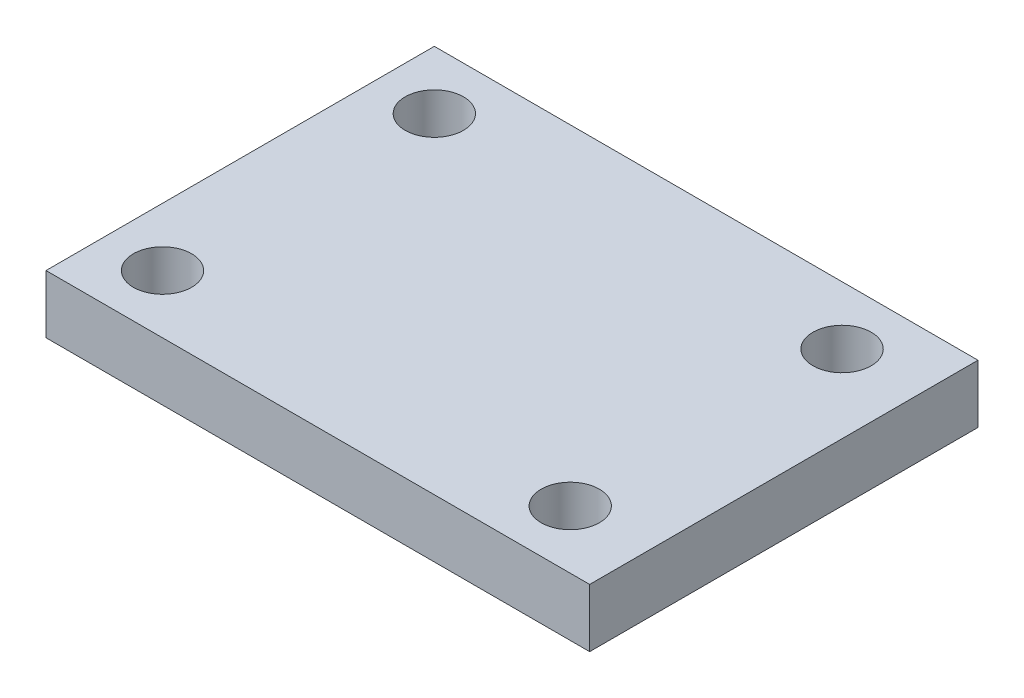
ISO-10303-21;
HEADER;
FILE_DESCRIPTION(('STEP AP214'),'2;1');
FILE_NAME('part.step','',(''),(''),'','','');
FILE_SCHEMA(('AUTOMOTIVE_DESIGN { 1 0 10303 214 1 1 1 1 }'));
ENDSEC;
DATA;
#1=APPLICATION_CONTEXT('core data for automotive mechanical design processes');
#2=APPLICATION_PROTOCOL_DEFINITION('international standard','automotive_design',2000,#1);
#3=PRODUCT_CONTEXT('',#1,'mechanical');
#4=PRODUCT('Part','Part','',(#3));
#5=PRODUCT_RELATED_PRODUCT_CATEGORY('part','',(#4));
#6=PRODUCT_DEFINITION_FORMATION('','',#4);
#7=PRODUCT_DEFINITION_CONTEXT('part definition',#1,'design');
#8=PRODUCT_DEFINITION('design','',#6,#7);
#9=PRODUCT_DEFINITION_SHAPE('','',#8);
#10=(LENGTH_UNIT() NAMED_UNIT(*) SI_UNIT(.MILLI.,.METRE.));
#11=(NAMED_UNIT(*) PLANE_ANGLE_UNIT() SI_UNIT($,.RADIAN.));
#12=(NAMED_UNIT(*) SI_UNIT($,.STERADIAN.) SOLID_ANGLE_UNIT());
#13=UNCERTAINTY_MEASURE_WITH_UNIT(LENGTH_MEASURE(1.E-05),#10,'distance_accuracy_value','');
#14=(GEOMETRIC_REPRESENTATION_CONTEXT(3) GLOBAL_UNCERTAINTY_ASSIGNED_CONTEXT((#13)) GLOBAL_UNIT_ASSIGNED_CONTEXT((#10,
#11,#12)) REPRESENTATION_CONTEXT('',''));
#15=CARTESIAN_POINT('',(0.,0.,0.));
#16=DIRECTION('',(0.,0.,1.));
#17=DIRECTION('',(1.,0.,0.));
#18=AXIS2_PLACEMENT_3D('',#15,#16,#17);
#19=CARTESIAN_POINT('',(13.9999999999999,3.,0.));
#20=DIRECTION('',(1.,0.,0.));
#21=DIRECTION('',(0.,0.,-1.));
#22=AXIS2_PLACEMENT_3D('',#19,#20,#21);
#23=PLANE('',#22);
#24=DIRECTION('',(0.,0.,1.));
#25=VECTOR('',#24,1.);
#26=CARTESIAN_POINT('',(13.9999999999999,0.,0.));
#27=LINE('',#26,#25);
#28=CARTESIAN_POINT('',(13.9999999999999,0.,-10.));
#29=VERTEX_POINT('',#28);
#30=CARTESIAN_POINT('',(13.9999999999999,0.,10.));
#31=VERTEX_POINT('',#30);
#32=EDGE_CURVE('E143',#29,#31,#27,.T.);
#33=ORIENTED_EDGE('',*,*,#32,.F.);
#34=DIRECTION('',(0.,-1.,0.));
#35=VECTOR('',#34,1.);
#36=CARTESIAN_POINT('',(13.9999999999999,3.,-10.));
#37=LINE('',#36,#35);
#38=CARTESIAN_POINT('',(13.9999999999999,3.,-10.));
#39=VERTEX_POINT('',#38);
#40=EDGE_CURVE('E11',#39,#29,#37,.T.);
#41=ORIENTED_EDGE('',*,*,#40,.F.);
#42=DIRECTION('',(0.,0.,1.));
#43=VECTOR('',#42,1.);
#44=CARTESIAN_POINT('',(13.9999999999999,3.,0.));
#45=LINE('',#44,#43);
#46=CARTESIAN_POINT('',(13.9999999999999,3.,10.));
#47=VERTEX_POINT('',#46);
#48=EDGE_CURVE('E117',#39,#47,#45,.T.);
#49=ORIENTED_EDGE('',*,*,#48,.T.);
#50=DIRECTION('',(0.,-1.,0.));
#51=VECTOR('',#50,1.);
#52=CARTESIAN_POINT('',(13.9999999999999,3.,10.));
#53=LINE('',#52,#51);
#54=EDGE_CURVE('E94',#47,#31,#53,.T.);
#55=ORIENTED_EDGE('',*,*,#54,.T.);
#56=EDGE_LOOP('',(#33,#41,#49,#55));
#57=FACE_BOUND('',#56,.T.);
#58=ADVANCED_FACE('F53',(#57),#23,.T.);
#59=CARTESIAN_POINT('',(0.,3.,-10.));
#60=DIRECTION('',(0.,0.,-1.));
#61=DIRECTION('',(-1.,0.,0.));
#62=AXIS2_PLACEMENT_3D('',#59,#60,#61);
#63=PLANE('',#62);
#64=DIRECTION('',(1.,0.,0.));
#65=VECTOR('',#64,1.);
#66=CARTESIAN_POINT('',(0.,0.,-10.));
#67=LINE('',#66,#65);
#68=CARTESIAN_POINT('',(-14.0000000000001,0.,-10.));
#69=VERTEX_POINT('',#68);
#70=EDGE_CURVE('E106',#69,#29,#67,.T.);
#71=ORIENTED_EDGE('',*,*,#70,.F.);
#72=DIRECTION('',(0.,-1.,0.));
#73=VECTOR('',#72,1.);
#74=CARTESIAN_POINT('',(-14.0000000000001,3.,-10.));
#75=LINE('',#74,#73);
#76=CARTESIAN_POINT('',(-14.0000000000001,3.,-10.));
#77=VERTEX_POINT('',#76);
#78=EDGE_CURVE('E63',#77,#69,#75,.T.);
#79=ORIENTED_EDGE('',*,*,#78,.F.);
#80=DIRECTION('',(1.,0.,0.));
#81=VECTOR('',#80,1.);
#82=CARTESIAN_POINT('',(0.,3.,-10.));
#83=LINE('',#82,#81);
#84=EDGE_CURVE('E104',#77,#39,#83,.T.);
#85=ORIENTED_EDGE('',*,*,#84,.T.);
#86=ORIENTED_EDGE('',*,*,#40,.T.);
#87=EDGE_LOOP('',(#71,#79,#85,#86));
#88=FACE_BOUND('',#87,.T.);
#89=ADVANCED_FACE('F102',(#88),#63,.T.);
#90=CARTESIAN_POINT('',(-14.0000000000001,3.,0.));
#91=DIRECTION('',(1.,0.,0.));
#92=DIRECTION('',(0.,0.,-1.));
#93=AXIS2_PLACEMENT_3D('',#90,#91,#92);
#94=PLANE('',#93);
#95=DIRECTION('',(0.,0.,1.));
#96=VECTOR('',#95,1.);
#97=CARTESIAN_POINT('',(-14.0000000000001,0.,0.));
#98=LINE('',#97,#96);
#99=CARTESIAN_POINT('',(-14.0000000000001,0.,10.));
#100=VERTEX_POINT('',#99);
#101=EDGE_CURVE('E148',#69,#100,#98,.T.);
#102=ORIENTED_EDGE('',*,*,#101,.T.);
#103=DIRECTION('',(0.,-1.,0.));
#104=VECTOR('',#103,1.);
#105=CARTESIAN_POINT('',(-14.0000000000001,3.,10.));
#106=LINE('',#105,#104);
#107=CARTESIAN_POINT('',(-14.0000000000001,3.,10.));
#108=VERTEX_POINT('',#107);
#109=EDGE_CURVE('E110',#108,#100,#106,.T.);
#110=ORIENTED_EDGE('',*,*,#109,.F.);
#111=DIRECTION('',(0.,0.,1.));
#112=VECTOR('',#111,1.);
#113=CARTESIAN_POINT('',(-14.0000000000001,3.,0.));
#114=LINE('',#113,#112);
#115=EDGE_CURVE('E112',#77,#108,#114,.T.);
#116=ORIENTED_EDGE('',*,*,#115,.F.);
#117=ORIENTED_EDGE('',*,*,#78,.T.);
#118=EDGE_LOOP('',(#102,#110,#116,#117));
#119=FACE_BOUND('',#118,.T.);
#120=ADVANCED_FACE('F113',(#119),#94,.F.);
#121=CARTESIAN_POINT('',(-11.,3.,-7.));
#122=DIRECTION('',(0.,-1.,0.));
#123=DIRECTION('',(0.,0.,-1.));
#124=AXIS2_PLACEMENT_3D('',#121,#122,#123);
#125=CYLINDRICAL_SURFACE('',#124,1.5);
#126=CARTESIAN_POINT('',(-11.,3.,-7.));
#127=DIRECTION('',(0.,1.,0.));
#128=DIRECTION('',(0.,0.,1.));
#129=AXIS2_PLACEMENT_3D('',#126,#127,#128);
#130=CIRCLE('',#129,1.5);
#131=CARTESIAN_POINT('',(-11.,3.,-5.5));
#132=VERTEX_POINT('',#131);
#133=EDGE_CURVE('E121',#132,#132,#130,.T.);
#134=ORIENTED_EDGE('',*,*,#133,.T.);
#135=EDGE_LOOP('',(#134));
#136=FACE_BOUND('',#135,.T.);
#137=CARTESIAN_POINT('',(-11.,0.,-7.));
#138=DIRECTION('',(0.,1.,0.));
#139=DIRECTION('',(0.,0.,1.));
#140=AXIS2_PLACEMENT_3D('',#137,#138,#139);
#141=CIRCLE('',#140,1.5);
#142=CARTESIAN_POINT('',(-11.,0.,-5.5));
#143=VERTEX_POINT('',#142);
#144=EDGE_CURVE('E139',#143,#143,#141,.T.);
#145=ORIENTED_EDGE('',*,*,#144,.F.);
#146=EDGE_LOOP('',(#145));
#147=FACE_BOUND('',#146,.T.);
#148=ADVANCED_FACE('F168',(#136,#147),#125,.F.);
#149=CARTESIAN_POINT('',(10.,3.,-7.));
#150=DIRECTION('',(0.,-1.,0.));
#151=DIRECTION('',(0.,0.,-1.));
#152=AXIS2_PLACEMENT_3D('',#149,#150,#151);
#153=CYLINDRICAL_SURFACE('',#152,1.5);
#154=CARTESIAN_POINT('',(10.,3.,-7.));
#155=DIRECTION('',(0.,1.,0.));
#156=DIRECTION('',(0.,0.,1.));
#157=AXIS2_PLACEMENT_3D('',#154,#155,#156);
#158=CIRCLE('',#157,1.5);
#159=CARTESIAN_POINT('',(10.,3.,-5.5));
#160=VERTEX_POINT('',#159);
#161=EDGE_CURVE('E274',#160,#160,#158,.T.);
#162=ORIENTED_EDGE('',*,*,#161,.T.);
#163=EDGE_LOOP('',(#162));
#164=FACE_BOUND('',#163,.T.);
#165=CARTESIAN_POINT('',(10.,0.,-7.));
#166=DIRECTION('',(0.,1.,0.));
#167=DIRECTION('',(0.,0.,1.));
#168=AXIS2_PLACEMENT_3D('',#165,#166,#167);
#169=CIRCLE('',#168,1.5);
#170=CARTESIAN_POINT('',(10.,0.,-5.5));
#171=VERTEX_POINT('',#170);
#172=EDGE_CURVE('E135',#171,#171,#169,.T.);
#173=ORIENTED_EDGE('',*,*,#172,.F.);
#174=EDGE_LOOP('',(#173));
#175=FACE_BOUND('',#174,.T.);
#176=ADVANCED_FACE('F171',(#164,#175),#153,.F.);
#177=CARTESIAN_POINT('',(-11.,3.,7.));
#178=DIRECTION('',(0.,-1.,0.));
#179=DIRECTION('',(0.,0.,-1.));
#180=AXIS2_PLACEMENT_3D('',#177,#178,#179);
#181=CYLINDRICAL_SURFACE('',#180,1.5);
#182=CARTESIAN_POINT('',(-11.,3.,7.));
#183=DIRECTION('',(0.,1.,0.));
#184=DIRECTION('',(0.,0.,1.));
#185=AXIS2_PLACEMENT_3D('',#182,#183,#184);
#186=CIRCLE('',#185,1.5);
#187=CARTESIAN_POINT('',(-11.,3.,8.5));
#188=VERTEX_POINT('',#187);
#189=EDGE_CURVE('E185',#188,#188,#186,.T.);
#190=ORIENTED_EDGE('',*,*,#189,.T.);
#191=EDGE_LOOP('',(#190));
#192=FACE_BOUND('',#191,.T.);
#193=CARTESIAN_POINT('',(-11.,0.,7.));
#194=DIRECTION('',(0.,1.,0.));
#195=DIRECTION('',(0.,0.,1.));
#196=AXIS2_PLACEMENT_3D('',#193,#194,#195);
#197=CIRCLE('',#196,1.5);
#198=CARTESIAN_POINT('',(-11.,0.,8.5));
#199=VERTEX_POINT('',#198);
#200=EDGE_CURVE('E131',#199,#199,#197,.T.);
#201=ORIENTED_EDGE('',*,*,#200,.F.);
#202=EDGE_LOOP('',(#201));
#203=FACE_BOUND('',#202,.T.);
#204=ADVANCED_FACE('F174',(#192,#203),#181,.F.);
#205=CARTESIAN_POINT('',(10.,3.,7.));
#206=DIRECTION('',(0.,-1.,0.));
#207=DIRECTION('',(0.,0.,-1.));
#208=AXIS2_PLACEMENT_3D('',#205,#206,#207);
#209=CYLINDRICAL_SURFACE('',#208,1.5);
#210=CARTESIAN_POINT('',(10.,3.,7.));
#211=DIRECTION('',(0.,1.,0.));
#212=DIRECTION('',(0.,0.,1.));
#213=AXIS2_PLACEMENT_3D('',#210,#211,#212);
#214=CIRCLE('',#213,1.5);
#215=CARTESIAN_POINT('',(10.,3.,8.5));
#216=VERTEX_POINT('',#215);
#217=EDGE_CURVE('E153',#216,#216,#214,.T.);
#218=ORIENTED_EDGE('',*,*,#217,.T.);
#219=EDGE_LOOP('',(#218));
#220=FACE_BOUND('',#219,.T.);
#221=CARTESIAN_POINT('',(10.,0.,7.));
#222=DIRECTION('',(0.,1.,0.));
#223=DIRECTION('',(0.,0.,1.));
#224=AXIS2_PLACEMENT_3D('',#221,#222,#223);
#225=CIRCLE('',#224,1.5);
#226=CARTESIAN_POINT('',(10.,0.,8.5));
#227=VERTEX_POINT('',#226);
#228=EDGE_CURVE('E127',#227,#227,#225,.T.);
#229=ORIENTED_EDGE('',*,*,#228,.F.);
#230=EDGE_LOOP('',(#229));
#231=FACE_BOUND('',#230,.T.);
#232=ADVANCED_FACE('F55',(#220,#231),#209,.F.);
#233=CARTESIAN_POINT('',(0.,3.,10.));
#234=DIRECTION('',(0.,0.,-1.));
#235=DIRECTION('',(-1.,0.,0.));
#236=AXIS2_PLACEMENT_3D('',#233,#234,#235);
#237=PLANE('',#236);
#238=DIRECTION('',(1.,0.,0.));
#239=VECTOR('',#238,1.);
#240=CARTESIAN_POINT('',(0.,0.,10.));
#241=LINE('',#240,#239);
#242=EDGE_CURVE('E87',#100,#31,#241,.T.);
#243=ORIENTED_EDGE('',*,*,#242,.T.);
#244=ORIENTED_EDGE('',*,*,#54,.F.);
#245=DIRECTION('',(1.,0.,0.));
#246=VECTOR('',#245,1.);
#247=CARTESIAN_POINT('',(0.,3.,10.));
#248=LINE('',#247,#246);
#249=EDGE_CURVE('E71',#108,#47,#248,.T.);
#250=ORIENTED_EDGE('',*,*,#249,.F.);
#251=ORIENTED_EDGE('',*,*,#109,.T.);
#252=EDGE_LOOP('',(#243,#244,#250,#251));
#253=FACE_BOUND('',#252,.T.);
#254=ADVANCED_FACE('F158',(#253),#237,.F.);
#255=CARTESIAN_POINT('',(0.,3.,0.));
#256=DIRECTION('',(0.,1.,0.));
#257=DIRECTION('',(0.,0.,1.));
#258=AXIS2_PLACEMENT_3D('',#255,#256,#257);
#259=PLANE('',#258);
#260=ORIENTED_EDGE('',*,*,#217,.F.);
#261=EDGE_LOOP('',(#260));
#262=FACE_BOUND('',#261,.T.);
#263=ORIENTED_EDGE('',*,*,#189,.F.);
#264=EDGE_LOOP('',(#263));
#265=FACE_BOUND('',#264,.T.);
#266=ORIENTED_EDGE('',*,*,#161,.F.);
#267=EDGE_LOOP('',(#266));
#268=FACE_BOUND('',#267,.T.);
#269=ORIENTED_EDGE('',*,*,#133,.F.);
#270=EDGE_LOOP('',(#269));
#271=FACE_BOUND('',#270,.T.);
#272=ORIENTED_EDGE('',*,*,#48,.F.);
#273=ORIENTED_EDGE('',*,*,#84,.F.);
#274=ORIENTED_EDGE('',*,*,#115,.T.);
#275=ORIENTED_EDGE('',*,*,#249,.T.);
#276=EDGE_LOOP('',(#272,#273,#274,#275));
#277=FACE_BOUND('',#276,.T.);
#278=ADVANCED_FACE('F116',(#262,#265,#268,#271,#277),#259,.T.);
#279=CARTESIAN_POINT('',(0.,0.,0.));
#280=DIRECTION('',(0.,1.,0.));
#281=DIRECTION('',(0.,0.,1.));
#282=AXIS2_PLACEMENT_3D('',#279,#280,#281);
#283=PLANE('',#282);
#284=ORIENTED_EDGE('',*,*,#228,.T.);
#285=EDGE_LOOP('',(#284));
#286=FACE_BOUND('',#285,.T.);
#287=ORIENTED_EDGE('',*,*,#200,.T.);
#288=EDGE_LOOP('',(#287));
#289=FACE_BOUND('',#288,.T.);
#290=ORIENTED_EDGE('',*,*,#172,.T.);
#291=EDGE_LOOP('',(#290));
#292=FACE_BOUND('',#291,.T.);
#293=ORIENTED_EDGE('',*,*,#144,.T.);
#294=EDGE_LOOP('',(#293));
#295=FACE_BOUND('',#294,.T.);
#296=ORIENTED_EDGE('',*,*,#32,.T.);
#297=ORIENTED_EDGE('',*,*,#242,.F.);
#298=ORIENTED_EDGE('',*,*,#101,.F.);
#299=ORIENTED_EDGE('',*,*,#70,.T.);
#300=EDGE_LOOP('',(#296,#297,#298,#299));
#301=FACE_BOUND('',#300,.T.);
#302=ADVANCED_FACE('F159',(#286,#289,#292,#295,#301),#283,.F.);
#303=CLOSED_SHELL('',(#58,#89,#120,#148,#176,#204,#232,#254,#278,#302));
#304=MANIFOLD_SOLID_BREP('B2',#303);
#305=ADVANCED_BREP_SHAPE_REPRESENTATION('',(#18,#304),#14);
#306=SHAPE_DEFINITION_REPRESENTATION(#9,#305);
ENDSEC;
END-ISO-10303-21;
